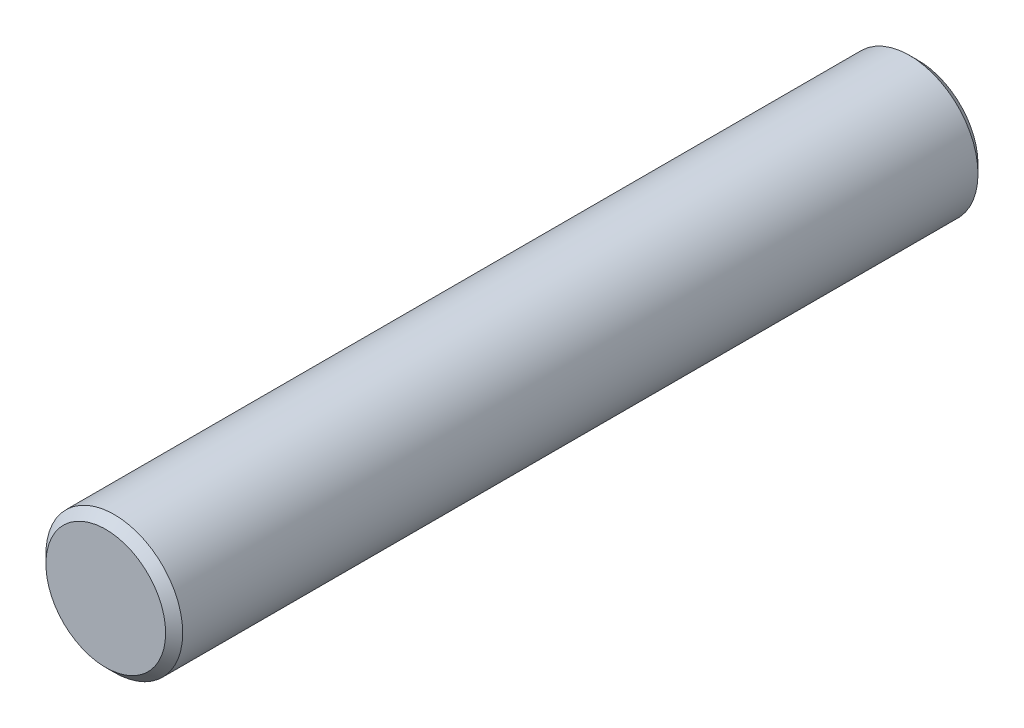
ISO-10303-21;
HEADER;
FILE_DESCRIPTION(('STEP AP214'),'2;1');
FILE_NAME('part.step','',(''),(''),'','','');
FILE_SCHEMA(('AUTOMOTIVE_DESIGN { 1 0 10303 214 1 1 1 1 }'));
ENDSEC;
DATA;
#1=APPLICATION_CONTEXT('core data for automotive mechanical design processes');
#2=APPLICATION_PROTOCOL_DEFINITION('international standard','automotive_design',2000,#1);
#3=PRODUCT_CONTEXT('',#1,'mechanical');
#4=PRODUCT('Part','Part','',(#3));
#5=PRODUCT_RELATED_PRODUCT_CATEGORY('part','',(#4));
#6=PRODUCT_DEFINITION_FORMATION('','',#4);
#7=PRODUCT_DEFINITION_CONTEXT('part definition',#1,'design');
#8=PRODUCT_DEFINITION('design','',#6,#7);
#9=PRODUCT_DEFINITION_SHAPE('','',#8);
#10=(LENGTH_UNIT() NAMED_UNIT(*) SI_UNIT(.MILLI.,.METRE.));
#11=(NAMED_UNIT(*) PLANE_ANGLE_UNIT() SI_UNIT($,.RADIAN.));
#12=(NAMED_UNIT(*) SI_UNIT($,.STERADIAN.) SOLID_ANGLE_UNIT());
#13=UNCERTAINTY_MEASURE_WITH_UNIT(LENGTH_MEASURE(1.E-05),#10,'distance_accuracy_value','');
#14=(GEOMETRIC_REPRESENTATION_CONTEXT(3) GLOBAL_UNCERTAINTY_ASSIGNED_CONTEXT((#13)) GLOBAL_UNIT_ASSIGNED_CONTEXT((#10,
#11,#12)) REPRESENTATION_CONTEXT('',''));
#15=CARTESIAN_POINT('',(0.,0.,0.));
#16=DIRECTION('',(0.,0.,1.));
#17=DIRECTION('',(1.,0.,0.));
#18=AXIS2_PLACEMENT_3D('',#15,#16,#17);
#19=CARTESIAN_POINT('',(0.,0.,47.5));
#20=DIRECTION('',(0.,0.,-1.));
#21=DIRECTION('',(-1.,0.,0.));
#22=AXIS2_PLACEMENT_3D('',#19,#20,#21);
#23=CYLINDRICAL_SURFACE('',#22,4.);
#24=CARTESIAN_POINT('',(0.,0.,0.500000000000007));
#25=DIRECTION('',(0.,0.,1.));
#26=DIRECTION('',(1.,0.,0.));
#27=AXIS2_PLACEMENT_3D('',#24,#25,#26);
#28=CIRCLE('',#27,4.);
#29=CARTESIAN_POINT('',(4.,0.,0.500000000000007));
#30=VERTEX_POINT('',#29);
#31=EDGE_CURVE('E47',#30,#30,#28,.T.);
#32=ORIENTED_EDGE('',*,*,#31,.T.);
#33=EDGE_LOOP('',(#32));
#34=FACE_BOUND('',#33,.T.);
#35=CARTESIAN_POINT('',(0.,0.,47.));
#36=DIRECTION('',(0.,0.,1.));
#37=DIRECTION('',(1.,0.,0.));
#38=AXIS2_PLACEMENT_3D('',#35,#36,#37);
#39=CIRCLE('',#38,4.);
#40=CARTESIAN_POINT('',(4.,0.,47.));
#41=VERTEX_POINT('',#40);
#42=EDGE_CURVE('E51',#41,#41,#39,.F.);
#43=ORIENTED_EDGE('',*,*,#42,.T.);
#44=EDGE_LOOP('',(#43));
#45=FACE_BOUND('',#44,.T.);
#46=ADVANCED_FACE('F35',(#34,#45),#23,.T.);
#47=CARTESIAN_POINT('',(0.,0.,47.5));
#48=DIRECTION('',(0.,0.,1.));
#49=DIRECTION('',(1.,0.,0.));
#50=AXIS2_PLACEMENT_3D('',#47,#48,#49);
#51=PLANE('',#50);
#52=CARTESIAN_POINT('',(0.,0.,47.5));
#53=DIRECTION('',(0.,0.,1.));
#54=DIRECTION('',(1.,0.,0.));
#55=AXIS2_PLACEMENT_3D('',#52,#53,#54);
#56=CIRCLE('',#55,3.5);
#57=CARTESIAN_POINT('',(3.5,0.,47.5));
#58=VERTEX_POINT('',#57);
#59=EDGE_CURVE('E10',#58,#58,#56,.T.);
#60=ORIENTED_EDGE('',*,*,#59,.T.);
#61=EDGE_LOOP('',(#60));
#62=FACE_BOUND('',#61,.T.);
#63=ADVANCED_FACE('F67',(#62),#51,.T.);
#64=CARTESIAN_POINT('',(0.,0.,0.));
#65=DIRECTION('',(0.,0.,1.));
#66=DIRECTION('',(1.,0.,0.));
#67=AXIS2_PLACEMENT_3D('',#64,#65,#66);
#68=PLANE('',#67);
#69=CARTESIAN_POINT('',(0.,0.,0.));
#70=DIRECTION('',(0.,0.,1.));
#71=DIRECTION('',(1.,0.,0.));
#72=AXIS2_PLACEMENT_3D('',#69,#70,#71);
#73=CIRCLE('',#72,3.49999999999999);
#74=CARTESIAN_POINT('',(3.49999999999999,0.,0.));
#75=VERTEX_POINT('',#74);
#76=EDGE_CURVE('E43',#75,#75,#73,.F.);
#77=ORIENTED_EDGE('',*,*,#76,.T.);
#78=EDGE_LOOP('',(#77));
#79=FACE_BOUND('',#78,.T.);
#80=ADVANCED_FACE('F64',(#79),#68,.F.);
#81=CARTESIAN_POINT('',(0.,0.,0.500000000000007));
#82=DIRECTION('',(0.,0.,1.));
#83=DIRECTION('',(1.,0.,0.));
#84=AXIS2_PLACEMENT_3D('',#81,#82,#83);
#85=CONICAL_SURFACE('',#84,4.,0.785398163397452);
#86=ORIENTED_EDGE('',*,*,#76,.F.);
#87=EDGE_LOOP('',(#86));
#88=FACE_BOUND('',#87,.T.);
#89=ORIENTED_EDGE('',*,*,#31,.F.);
#90=EDGE_LOOP('',(#89));
#91=FACE_BOUND('',#90,.T.);
#92=ADVANCED_FACE('F60',(#88,#91),#85,.T.);
#93=CARTESIAN_POINT('',(0.,0.,47.5));
#94=DIRECTION('',(0.,0.,-1.));
#95=DIRECTION('',(-1.,0.,0.));
#96=AXIS2_PLACEMENT_3D('',#93,#94,#95);
#97=CONICAL_SURFACE('',#96,3.5,0.785398163397445);
#98=ORIENTED_EDGE('',*,*,#42,.F.);
#99=EDGE_LOOP('',(#98));
#100=FACE_BOUND('',#99,.T.);
#101=ORIENTED_EDGE('',*,*,#59,.F.);
#102=EDGE_LOOP('',(#101));
#103=FACE_BOUND('',#102,.T.);
#104=ADVANCED_FACE('F38',(#100,#103),#97,.T.);
#105=CLOSED_SHELL('',(#46,#63,#80,#92,#104));
#106=MANIFOLD_SOLID_BREP('B2',#105);
#107=ADVANCED_BREP_SHAPE_REPRESENTATION('',(#18,#106),#14);
#108=SHAPE_DEFINITION_REPRESENTATION(#9,#107);
ENDSEC;
END-ISO-10303-21;
